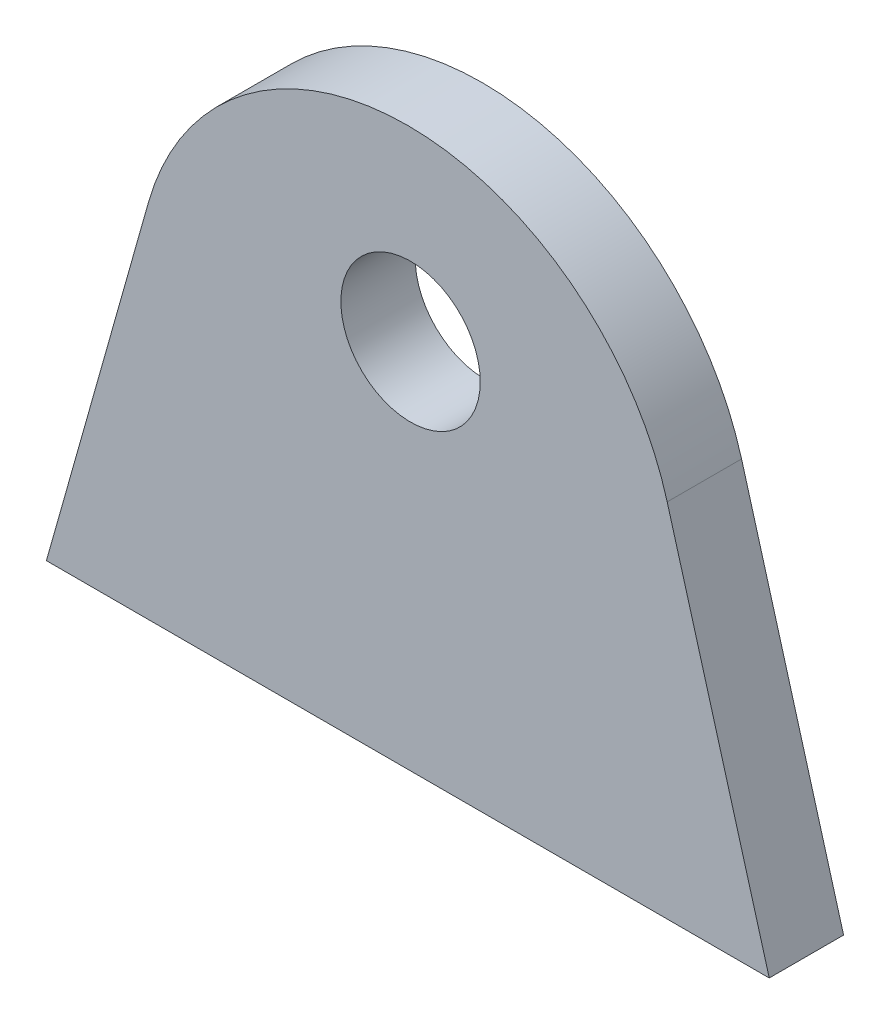
ISO-10303-21;
HEADER;
FILE_DESCRIPTION(('STEP AP214'),'2;1');
FILE_NAME('part.step','',(''),(''),'','','');
FILE_SCHEMA(('AUTOMOTIVE_DESIGN { 1 0 10303 214 1 1 1 1 }'));
ENDSEC;
DATA;
#1=APPLICATION_CONTEXT('core data for automotive mechanical design processes');
#2=APPLICATION_PROTOCOL_DEFINITION('international standard','automotive_design',2000,#1);
#3=PRODUCT_CONTEXT('',#1,'mechanical');
#4=PRODUCT('Part','Part','',(#3));
#5=PRODUCT_RELATED_PRODUCT_CATEGORY('part','',(#4));
#6=PRODUCT_DEFINITION_FORMATION('','',#4);
#7=PRODUCT_DEFINITION_CONTEXT('part definition',#1,'design');
#8=PRODUCT_DEFINITION('design','',#6,#7);
#9=PRODUCT_DEFINITION_SHAPE('','',#8);
#10=(LENGTH_UNIT() NAMED_UNIT(*) SI_UNIT(.MILLI.,.METRE.));
#11=(NAMED_UNIT(*) PLANE_ANGLE_UNIT() SI_UNIT($,.RADIAN.));
#12=(NAMED_UNIT(*) SI_UNIT($,.STERADIAN.) SOLID_ANGLE_UNIT());
#13=UNCERTAINTY_MEASURE_WITH_UNIT(LENGTH_MEASURE(1.E-05),#10,'distance_accuracy_value','');
#14=(GEOMETRIC_REPRESENTATION_CONTEXT(3) GLOBAL_UNCERTAINTY_ASSIGNED_CONTEXT((#13)) GLOBAL_UNIT_ASSIGNED_CONTEXT((#10,
#11,#12)) REPRESENTATION_CONTEXT('',''));
#15=CARTESIAN_POINT('',(0.,0.,0.));
#16=DIRECTION('',(0.,0.,1.));
#17=DIRECTION('',(1.,0.,0.));
#18=AXIS2_PLACEMENT_3D('',#15,#16,#17);
#19=CARTESIAN_POINT('',(12.3475361650236,9.84197869727485,2.54));
#20=DIRECTION('',(0.,0.,-1.));
#21=DIRECTION('',(-1.,0.,0.));
#22=AXIS2_PLACEMENT_3D('',#19,#20,#21);
#23=PLANE('',#22);
#24=DIRECTION('',(-0.271771997156175,-0.962361668792842,0.));
#25=VECTOR('',#24,1.);
#26=CARTESIAN_POINT('',(0.,0.,2.54));
#27=LINE('',#26,#25);
#28=CARTESIAN_POINT('',(3.48608941785297,12.3444610365731,2.54));
#29=VERTEX_POINT('',#28);
#30=CARTESIAN_POINT('',(0.,0.,2.54));
#31=VERTEX_POINT('',#30);
#32=EDGE_CURVE('E92',#29,#31,#27,.T.);
#33=ORIENTED_EDGE('',*,*,#32,.T.);
#34=DIRECTION('',(1.,0.,0.));
#35=VECTOR('',#34,1.);
#36=CARTESIAN_POINT('',(0.,0.,2.54));
#37=LINE('',#36,#35);
#38=CARTESIAN_POINT('',(24.6950723300472,0.,2.54));
#39=VERTEX_POINT('',#38);
#40=EDGE_CURVE('E87',#31,#39,#37,.T.);
#41=ORIENTED_EDGE('',*,*,#40,.T.);
#42=DIRECTION('',(-0.271771997156175,0.962361668792842,0.));
#43=VECTOR('',#42,1.);
#44=CARTESIAN_POINT('',(24.6950723300472,0.,2.54));
#45=LINE('',#44,#43);
#46=CARTESIAN_POINT('',(21.2089829121942,12.3444610365731,2.54));
#47=VERTEX_POINT('',#46);
#48=EDGE_CURVE('E90',#39,#47,#45,.T.);
#49=ORIENTED_EDGE('',*,*,#48,.T.);
#50=CARTESIAN_POINT('',(12.3475361650236,9.84197869727485,2.54));
#51=DIRECTION('',(0.,0.,1.));
#52=DIRECTION('',(-1.,0.,0.));
#53=AXIS2_PLACEMENT_3D('',#50,#51,#52);
#54=CIRCLE('',#53,9.20802130272515);
#55=EDGE_CURVE('E57',#47,#29,#54,.T.);
#56=ORIENTED_EDGE('',*,*,#55,.T.);
#57=EDGE_LOOP('',(#33,#41,#49,#56));
#58=FACE_BOUND('',#57,.T.);
#59=CARTESIAN_POINT('',(12.4407456924666,12.6996579475194,2.54));
#60=DIRECTION('',(0.,0.,1.));
#61=DIRECTION('',(1.,0.,0.));
#62=AXIS2_PLACEMENT_3D('',#59,#60,#61);
#63=CIRCLE('',#62,2.38125);
#64=CARTESIAN_POINT('',(14.8219956924666,12.6996579475194,2.54));
#65=VERTEX_POINT('',#64);
#66=EDGE_CURVE('E112',#65,#65,#63,.T.);
#67=ORIENTED_EDGE('',*,*,#66,.F.);
#68=EDGE_LOOP('',(#67));
#69=FACE_BOUND('',#68,.T.);
#70=ADVANCED_FACE('F39',(#58,#69),#23,.F.);
#71=CARTESIAN_POINT('',(12.3475361650236,9.84197869727485,0.));
#72=DIRECTION('',(0.,0.,-1.));
#73=DIRECTION('',(-1.,0.,0.));
#74=AXIS2_PLACEMENT_3D('',#71,#72,#73);
#75=PLANE('',#74);
#76=DIRECTION('',(-0.271771997156175,-0.962361668792842,0.));
#77=VECTOR('',#76,1.);
#78=CARTESIAN_POINT('',(0.,0.,0.));
#79=LINE('',#78,#77);
#80=CARTESIAN_POINT('',(3.48608941785297,12.3444610365731,0.));
#81=VERTEX_POINT('',#80);
#82=CARTESIAN_POINT('',(0.,0.,0.));
#83=VERTEX_POINT('',#82);
#84=EDGE_CURVE('E108',#81,#83,#79,.T.);
#85=ORIENTED_EDGE('',*,*,#84,.F.);
#86=CARTESIAN_POINT('',(12.3475361650236,9.84197869727485,0.));
#87=DIRECTION('',(0.,0.,1.));
#88=DIRECTION('',(-1.,0.,0.));
#89=AXIS2_PLACEMENT_3D('',#86,#87,#88);
#90=CIRCLE('',#89,9.20802130272515);
#91=CARTESIAN_POINT('',(21.2089829121942,12.3444610365731,0.));
#92=VERTEX_POINT('',#91);
#93=EDGE_CURVE('E80',#92,#81,#90,.T.);
#94=ORIENTED_EDGE('',*,*,#93,.F.);
#95=DIRECTION('',(-0.271771997156175,0.962361668792842,0.));
#96=VECTOR('',#95,1.);
#97=CARTESIAN_POINT('',(24.6950723300472,0.,0.));
#98=LINE('',#97,#96);
#99=CARTESIAN_POINT('',(24.6950723300472,0.,0.));
#100=VERTEX_POINT('',#99);
#101=EDGE_CURVE('E74',#100,#92,#98,.T.);
#102=ORIENTED_EDGE('',*,*,#101,.F.);
#103=DIRECTION('',(1.,0.,0.));
#104=VECTOR('',#103,1.);
#105=CARTESIAN_POINT('',(0.,0.,0.));
#106=LINE('',#105,#104);
#107=EDGE_CURVE('E97',#83,#100,#106,.T.);
#108=ORIENTED_EDGE('',*,*,#107,.F.);
#109=EDGE_LOOP('',(#85,#94,#102,#108));
#110=FACE_BOUND('',#109,.T.);
#111=CARTESIAN_POINT('',(12.4407456924666,12.6996579475194,0.));
#112=DIRECTION('',(0.,0.,1.));
#113=DIRECTION('',(1.,0.,0.));
#114=AXIS2_PLACEMENT_3D('',#111,#112,#113);
#115=CIRCLE('',#114,2.38125);
#116=CARTESIAN_POINT('',(14.8219956924666,12.6996579475194,0.));
#117=VERTEX_POINT('',#116);
#118=EDGE_CURVE('E130',#117,#117,#115,.T.);
#119=ORIENTED_EDGE('',*,*,#118,.T.);
#120=EDGE_LOOP('',(#119));
#121=FACE_BOUND('',#120,.T.);
#122=ADVANCED_FACE('F125',(#110,#121),#75,.T.);
#123=CARTESIAN_POINT('',(0.,0.,2.54));
#124=DIRECTION('',(0.962361668792842,-0.271771997156175,0.));
#125=DIRECTION('',(0.271771997156175,0.962361668792842,0.));
#126=AXIS2_PLACEMENT_3D('',#123,#124,#125);
#127=PLANE('',#126);
#128=ORIENTED_EDGE('',*,*,#84,.T.);
#129=DIRECTION('',(0.,0.,-1.));
#130=VECTOR('',#129,1.);
#131=CARTESIAN_POINT('',(0.,0.,2.54));
#132=LINE('',#131,#130);
#133=EDGE_CURVE('E11',#31,#83,#132,.T.);
#134=ORIENTED_EDGE('',*,*,#133,.F.);
#135=ORIENTED_EDGE('',*,*,#32,.F.);
#136=DIRECTION('',(0.,0.,-1.));
#137=VECTOR('',#136,1.);
#138=CARTESIAN_POINT('',(3.48608941785297,12.3444610365731,2.54));
#139=LINE('',#138,#137);
#140=EDGE_CURVE('E104',#29,#81,#139,.T.);
#141=ORIENTED_EDGE('',*,*,#140,.T.);
#142=EDGE_LOOP('',(#128,#134,#135,#141));
#143=FACE_BOUND('',#142,.T.);
#144=ADVANCED_FACE('F41',(#143),#127,.F.);
#145=CARTESIAN_POINT('',(0.,0.,2.54));
#146=DIRECTION('',(0.,1.,0.));
#147=DIRECTION('',(-1.,0.,0.));
#148=AXIS2_PLACEMENT_3D('',#145,#146,#147);
#149=PLANE('',#148);
#150=ORIENTED_EDGE('',*,*,#107,.T.);
#151=DIRECTION('',(0.,0.,-1.));
#152=VECTOR('',#151,1.);
#153=CARTESIAN_POINT('',(24.6950723300472,0.,2.54));
#154=LINE('',#153,#152);
#155=EDGE_CURVE('E49',#39,#100,#154,.T.);
#156=ORIENTED_EDGE('',*,*,#155,.F.);
#157=ORIENTED_EDGE('',*,*,#40,.F.);
#158=ORIENTED_EDGE('',*,*,#133,.T.);
#159=EDGE_LOOP('',(#150,#156,#157,#158));
#160=FACE_BOUND('',#159,.T.);
#161=ADVANCED_FACE('F96',(#160),#149,.F.);
#162=CARTESIAN_POINT('',(24.6950723300472,0.,2.54));
#163=DIRECTION('',(-0.962361668792842,-0.271771997156175,0.));
#164=DIRECTION('',(0.271771997156175,-0.962361668792842,0.));
#165=AXIS2_PLACEMENT_3D('',#162,#163,#164);
#166=PLANE('',#165);
#167=ORIENTED_EDGE('',*,*,#101,.T.);
#168=DIRECTION('',(0.,0.,-1.));
#169=VECTOR('',#168,1.);
#170=CARTESIAN_POINT('',(21.2089829121942,12.3444610365731,2.54));
#171=LINE('',#170,#169);
#172=EDGE_CURVE('E99',#47,#92,#171,.T.);
#173=ORIENTED_EDGE('',*,*,#172,.F.);
#174=ORIENTED_EDGE('',*,*,#48,.F.);
#175=ORIENTED_EDGE('',*,*,#155,.T.);
#176=EDGE_LOOP('',(#167,#173,#174,#175));
#177=FACE_BOUND('',#176,.T.);
#178=ADVANCED_FACE('F100',(#177),#166,.F.);
#179=CARTESIAN_POINT('',(12.3475361650236,9.84197869727485,2.54));
#180=DIRECTION('',(0.,0.,-1.));
#181=DIRECTION('',(-1.,0.,0.));
#182=AXIS2_PLACEMENT_3D('',#179,#180,#181);
#183=CYLINDRICAL_SURFACE('',#182,9.20802130272515);
#184=ORIENTED_EDGE('',*,*,#93,.T.);
#185=ORIENTED_EDGE('',*,*,#140,.F.);
#186=ORIENTED_EDGE('',*,*,#55,.F.);
#187=ORIENTED_EDGE('',*,*,#172,.T.);
#188=EDGE_LOOP('',(#184,#185,#186,#187));
#189=FACE_BOUND('',#188,.T.);
#190=ADVANCED_FACE('F122',(#189),#183,.T.);
#191=CARTESIAN_POINT('',(12.4407456924666,12.6996579475194,2.54));
#192=DIRECTION('',(0.,0.,-1.));
#193=DIRECTION('',(-1.,0.,0.));
#194=AXIS2_PLACEMENT_3D('',#191,#192,#193);
#195=CYLINDRICAL_SURFACE('',#194,2.38125);
#196=ORIENTED_EDGE('',*,*,#66,.T.);
#197=EDGE_LOOP('',(#196));
#198=FACE_BOUND('',#197,.T.);
#199=ORIENTED_EDGE('',*,*,#118,.F.);
#200=EDGE_LOOP('',(#199));
#201=FACE_BOUND('',#200,.T.);
#202=ADVANCED_FACE('F138',(#198,#201),#195,.F.);
#203=CLOSED_SHELL('',(#70,#122,#144,#161,#178,#190,#202));
#204=MANIFOLD_SOLID_BREP('B2',#203);
#205=ADVANCED_BREP_SHAPE_REPRESENTATION('',(#18,#204),#14);
#206=SHAPE_DEFINITION_REPRESENTATION(#9,#205);
ENDSEC;
END-ISO-10303-21;
